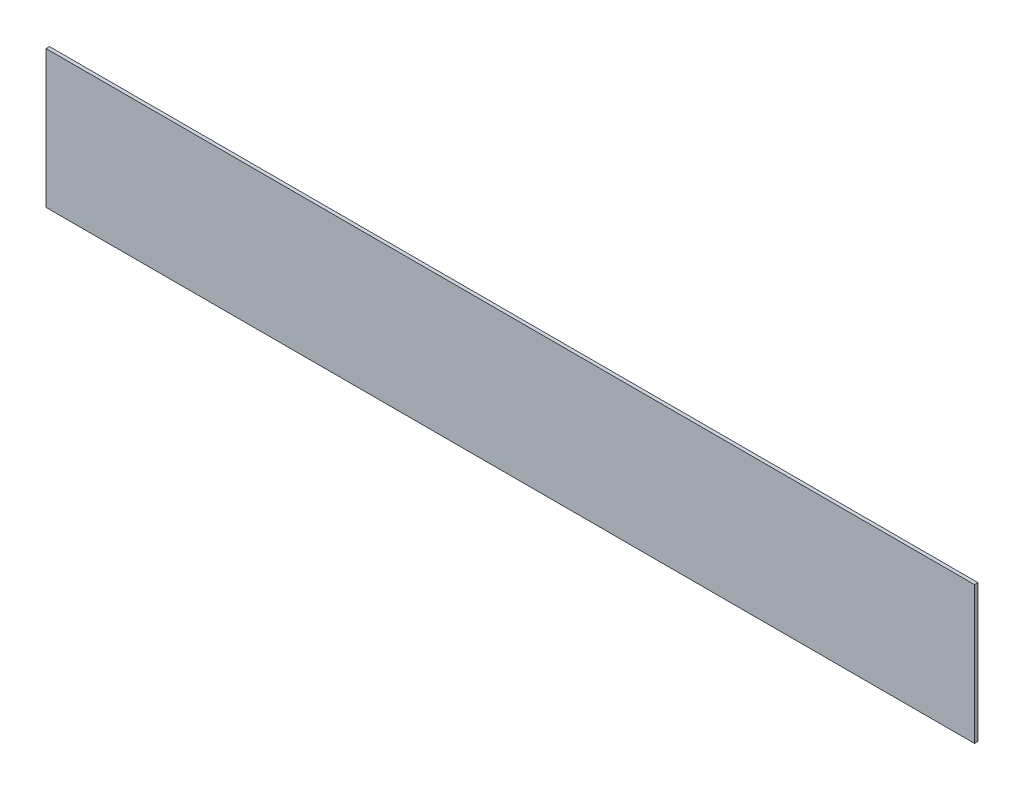
ISO-10303-21;
HEADER;
FILE_DESCRIPTION(('STEP AP214'),'2;1');
FILE_NAME('part.step','',(''),(''),'','','');
FILE_SCHEMA(('AUTOMOTIVE_DESIGN { 1 0 10303 214 1 1 1 1 }'));
ENDSEC;
DATA;
#1=APPLICATION_CONTEXT('core data for automotive mechanical design processes');
#2=APPLICATION_PROTOCOL_DEFINITION('international standard','automotive_design',2000,#1);
#3=PRODUCT_CONTEXT('',#1,'mechanical');
#4=PRODUCT('Part','Part','',(#3));
#5=PRODUCT_RELATED_PRODUCT_CATEGORY('part','',(#4));
#6=PRODUCT_DEFINITION_FORMATION('','',#4);
#7=PRODUCT_DEFINITION_CONTEXT('part definition',#1,'design');
#8=PRODUCT_DEFINITION('design','',#6,#7);
#9=PRODUCT_DEFINITION_SHAPE('','',#8);
#10=(LENGTH_UNIT() NAMED_UNIT(*) SI_UNIT(.MILLI.,.METRE.));
#11=(NAMED_UNIT(*) PLANE_ANGLE_UNIT() SI_UNIT($,.RADIAN.));
#12=(NAMED_UNIT(*) SI_UNIT($,.STERADIAN.) SOLID_ANGLE_UNIT());
#13=UNCERTAINTY_MEASURE_WITH_UNIT(LENGTH_MEASURE(1.E-05),#10,'distance_accuracy_value','');
#14=(GEOMETRIC_REPRESENTATION_CONTEXT(3) GLOBAL_UNCERTAINTY_ASSIGNED_CONTEXT((#13)) GLOBAL_UNIT_ASSIGNED_CONTEXT((#10,
#11,#12)) REPRESENTATION_CONTEXT('',''));
#15=CARTESIAN_POINT('',(0.,0.,0.));
#16=DIRECTION('',(0.,0.,1.));
#17=DIRECTION('',(1.,0.,0.));
#18=AXIS2_PLACEMENT_3D('',#15,#16,#17);
#19=CARTESIAN_POINT('',(135.,20.,1.));
#20=DIRECTION('',(-1.,0.,0.));
#21=DIRECTION('',(0.,0.,1.));
#22=AXIS2_PLACEMENT_3D('',#19,#20,#21);
#23=PLANE('',#22);
#24=DIRECTION('',(0.,1.,0.));
#25=VECTOR('',#24,1.);
#26=CARTESIAN_POINT('',(135.,20.,0.));
#27=LINE('',#26,#25);
#28=CARTESIAN_POINT('',(135.,-20.,0.));
#29=VERTEX_POINT('',#28);
#30=CARTESIAN_POINT('',(135.,20.,0.));
#31=VERTEX_POINT('',#30);
#32=EDGE_CURVE('E96',#29,#31,#27,.T.);
#33=ORIENTED_EDGE('',*,*,#32,.T.);
#34=DIRECTION('',(0.,0.,-1.));
#35=VECTOR('',#34,1.);
#36=CARTESIAN_POINT('',(135.,20.,1.));
#37=LINE('',#36,#35);
#38=CARTESIAN_POINT('',(135.,20.,1.));
#39=VERTEX_POINT('',#38);
#40=EDGE_CURVE('E11',#39,#31,#37,.T.);
#41=ORIENTED_EDGE('',*,*,#40,.F.);
#42=DIRECTION('',(0.,1.,0.));
#43=VECTOR('',#42,1.);
#44=CARTESIAN_POINT('',(135.,20.,1.));
#45=LINE('',#44,#43);
#46=CARTESIAN_POINT('',(135.,-20.,1.));
#47=VERTEX_POINT('',#46);
#48=EDGE_CURVE('E84',#47,#39,#45,.T.);
#49=ORIENTED_EDGE('',*,*,#48,.F.);
#50=DIRECTION('',(0.,0.,-1.));
#51=VECTOR('',#50,1.);
#52=CARTESIAN_POINT('',(135.,-20.,1.));
#53=LINE('',#52,#51);
#54=EDGE_CURVE('E92',#47,#29,#53,.T.);
#55=ORIENTED_EDGE('',*,*,#54,.T.);
#56=EDGE_LOOP('',(#33,#41,#49,#55));
#57=FACE_BOUND('',#56,.T.);
#58=ADVANCED_FACE('F33',(#57),#23,.F.);
#59=CARTESIAN_POINT('',(-135.,20.,1.));
#60=DIRECTION('',(0.,-1.,0.));
#61=DIRECTION('',(0.,0.,-1.));
#62=AXIS2_PLACEMENT_3D('',#59,#60,#61);
#63=PLANE('',#62);
#64=DIRECTION('',(-1.,0.,0.));
#65=VECTOR('',#64,1.);
#66=CARTESIAN_POINT('',(-135.,20.,0.));
#67=LINE('',#66,#65);
#68=CARTESIAN_POINT('',(-135.,20.,0.));
#69=VERTEX_POINT('',#68);
#70=EDGE_CURVE('E88',#31,#69,#67,.T.);
#71=ORIENTED_EDGE('',*,*,#70,.T.);
#72=DIRECTION('',(0.,0.,-1.));
#73=VECTOR('',#72,1.);
#74=CARTESIAN_POINT('',(-135.,20.,1.));
#75=LINE('',#74,#73);
#76=CARTESIAN_POINT('',(-135.,20.,1.));
#77=VERTEX_POINT('',#76);
#78=EDGE_CURVE('E41',#77,#69,#75,.T.);
#79=ORIENTED_EDGE('',*,*,#78,.F.);
#80=DIRECTION('',(-1.,0.,0.));
#81=VECTOR('',#80,1.);
#82=CARTESIAN_POINT('',(-135.,20.,1.));
#83=LINE('',#82,#81);
#84=EDGE_CURVE('E79',#39,#77,#83,.T.);
#85=ORIENTED_EDGE('',*,*,#84,.F.);
#86=ORIENTED_EDGE('',*,*,#40,.T.);
#87=EDGE_LOOP('',(#71,#79,#85,#86));
#88=FACE_BOUND('',#87,.T.);
#89=ADVANCED_FACE('F87',(#88),#63,.F.);
#90=CARTESIAN_POINT('',(-135.,20.,1.));
#91=DIRECTION('',(1.,0.,0.));
#92=DIRECTION('',(0.,0.,-1.));
#93=AXIS2_PLACEMENT_3D('',#90,#91,#92);
#94=PLANE('',#93);
#95=DIRECTION('',(0.,-1.,0.));
#96=VECTOR('',#95,1.);
#97=CARTESIAN_POINT('',(-135.,20.,0.));
#98=LINE('',#97,#96);
#99=CARTESIAN_POINT('',(-135.,-20.,0.));
#100=VERTEX_POINT('',#99);
#101=EDGE_CURVE('E66',#69,#100,#98,.T.);
#102=ORIENTED_EDGE('',*,*,#101,.T.);
#103=DIRECTION('',(0.,0.,-1.));
#104=VECTOR('',#103,1.);
#105=CARTESIAN_POINT('',(-135.,-20.,1.));
#106=LINE('',#105,#104);
#107=CARTESIAN_POINT('',(-135.,-20.,1.));
#108=VERTEX_POINT('',#107);
#109=EDGE_CURVE('E89',#108,#100,#106,.T.);
#110=ORIENTED_EDGE('',*,*,#109,.F.);
#111=DIRECTION('',(0.,-1.,0.));
#112=VECTOR('',#111,1.);
#113=CARTESIAN_POINT('',(-135.,20.,1.));
#114=LINE('',#113,#112);
#115=EDGE_CURVE('E82',#77,#108,#114,.T.);
#116=ORIENTED_EDGE('',*,*,#115,.F.);
#117=ORIENTED_EDGE('',*,*,#78,.T.);
#118=EDGE_LOOP('',(#102,#110,#116,#117));
#119=FACE_BOUND('',#118,.T.);
#120=ADVANCED_FACE('F90',(#119),#94,.F.);
#121=CARTESIAN_POINT('',(-135.,-20.,1.));
#122=DIRECTION('',(0.,1.,0.));
#123=DIRECTION('',(0.,0.,1.));
#124=AXIS2_PLACEMENT_3D('',#121,#122,#123);
#125=PLANE('',#124);
#126=DIRECTION('',(1.,0.,0.));
#127=VECTOR('',#126,1.);
#128=CARTESIAN_POINT('',(-135.,-20.,0.));
#129=LINE('',#128,#127);
#130=EDGE_CURVE('E72',#100,#29,#129,.T.);
#131=ORIENTED_EDGE('',*,*,#130,.T.);
#132=ORIENTED_EDGE('',*,*,#54,.F.);
#133=DIRECTION('',(1.,0.,0.));
#134=VECTOR('',#133,1.);
#135=CARTESIAN_POINT('',(-135.,-20.,1.));
#136=LINE('',#135,#134);
#137=EDGE_CURVE('E49',#108,#47,#136,.T.);
#138=ORIENTED_EDGE('',*,*,#137,.F.);
#139=ORIENTED_EDGE('',*,*,#109,.T.);
#140=EDGE_LOOP('',(#131,#132,#138,#139));
#141=FACE_BOUND('',#140,.T.);
#142=ADVANCED_FACE('F103',(#141),#125,.F.);
#143=CARTESIAN_POINT('',(0.,0.,1.));
#144=DIRECTION('',(0.,0.,1.));
#145=DIRECTION('',(1.,0.,0.));
#146=AXIS2_PLACEMENT_3D('',#143,#144,#145);
#147=PLANE('',#146);
#148=ORIENTED_EDGE('',*,*,#48,.T.);
#149=ORIENTED_EDGE('',*,*,#84,.T.);
#150=ORIENTED_EDGE('',*,*,#115,.T.);
#151=ORIENTED_EDGE('',*,*,#137,.T.);
#152=EDGE_LOOP('',(#148,#149,#150,#151));
#153=FACE_BOUND('',#152,.T.);
#154=ADVANCED_FACE('F80',(#153),#147,.T.);
#155=CARTESIAN_POINT('',(0.,0.,0.));
#156=DIRECTION('',(0.,0.,1.));
#157=DIRECTION('',(1.,0.,0.));
#158=AXIS2_PLACEMENT_3D('',#155,#156,#157);
#159=PLANE('',#158);
#160=ORIENTED_EDGE('',*,*,#32,.F.);
#161=ORIENTED_EDGE('',*,*,#130,.F.);
#162=ORIENTED_EDGE('',*,*,#101,.F.);
#163=ORIENTED_EDGE('',*,*,#70,.F.);
#164=EDGE_LOOP('',(#160,#161,#162,#163));
#165=FACE_BOUND('',#164,.T.);
#166=ADVANCED_FACE('F106',(#165),#159,.F.);
#167=CLOSED_SHELL('',(#58,#89,#120,#142,#154,#166));
#168=MANIFOLD_SOLID_BREP('B2',#167);
#169=ADVANCED_BREP_SHAPE_REPRESENTATION('',(#18,#168),#14);
#170=SHAPE_DEFINITION_REPRESENTATION(#9,#169);
ENDSEC;
END-ISO-10303-21;
